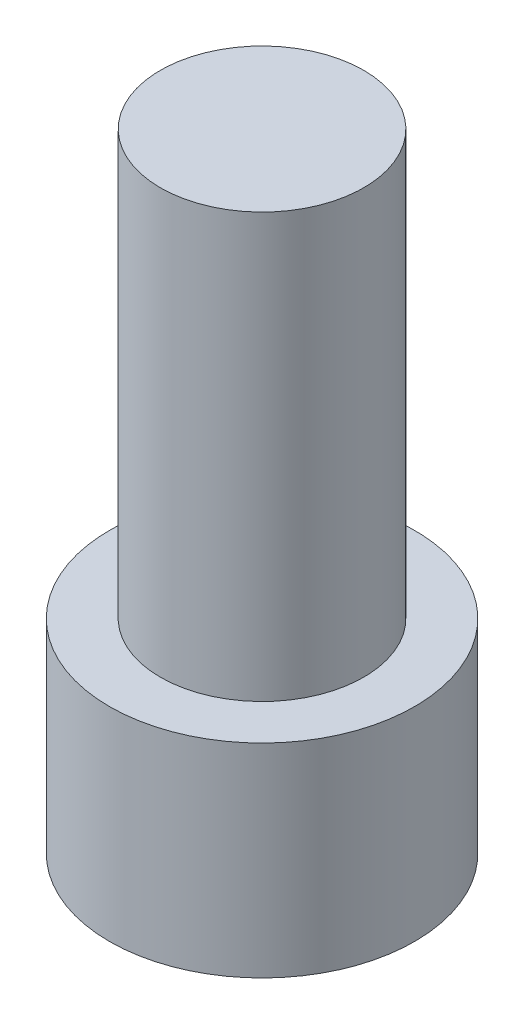
ISO-10303-21;
HEADER;
FILE_DESCRIPTION(('STEP AP214'),'2;1');
FILE_NAME('part.step','',(''),(''),'','','');
FILE_SCHEMA(('AUTOMOTIVE_DESIGN { 1 0 10303 214 1 1 1 1 }'));
ENDSEC;
DATA;
#1=APPLICATION_CONTEXT('core data for automotive mechanical design processes');
#2=APPLICATION_PROTOCOL_DEFINITION('international standard','automotive_design',2000,#1);
#3=PRODUCT_CONTEXT('',#1,'mechanical');
#4=PRODUCT('Part','Part','',(#3));
#5=PRODUCT_RELATED_PRODUCT_CATEGORY('part','',(#4));
#6=PRODUCT_DEFINITION_FORMATION('','',#4);
#7=PRODUCT_DEFINITION_CONTEXT('part definition',#1,'design');
#8=PRODUCT_DEFINITION('design','',#6,#7);
#9=PRODUCT_DEFINITION_SHAPE('','',#8);
#10=(LENGTH_UNIT() NAMED_UNIT(*) SI_UNIT(.MILLI.,.METRE.));
#11=(NAMED_UNIT(*) PLANE_ANGLE_UNIT() SI_UNIT($,.RADIAN.));
#12=(NAMED_UNIT(*) SI_UNIT($,.STERADIAN.) SOLID_ANGLE_UNIT());
#13=UNCERTAINTY_MEASURE_WITH_UNIT(LENGTH_MEASURE(1.E-05),#10,'distance_accuracy_value','');
#14=(GEOMETRIC_REPRESENTATION_CONTEXT(3) GLOBAL_UNCERTAINTY_ASSIGNED_CONTEXT((#13)) GLOBAL_UNIT_ASSIGNED_CONTEXT((#10,
#11,#12)) REPRESENTATION_CONTEXT('',''));
#15=CARTESIAN_POINT('',(0.,0.,0.));
#16=DIRECTION('',(0.,0.,1.));
#17=DIRECTION('',(1.,0.,0.));
#18=AXIS2_PLACEMENT_3D('',#15,#16,#17);
#19=CARTESIAN_POINT('',(0.,12.,0.));
#20=DIRECTION('',(0.,1.,0.));
#21=DIRECTION('',(0.,0.,1.));
#22=AXIS2_PLACEMENT_3D('',#19,#20,#21);
#23=PLANE('',#22);
#24=CARTESIAN_POINT('',(0.,12.,0.));
#25=DIRECTION('',(0.,1.,0.));
#26=DIRECTION('',(0.,0.,1.));
#27=AXIS2_PLACEMENT_3D('',#24,#25,#26);
#28=CIRCLE('',#27,9.);
#29=CARTESIAN_POINT('',(0.,12.,9.));
#30=VERTEX_POINT('',#29);
#31=EDGE_CURVE('E10',#30,#30,#28,.T.);
#32=ORIENTED_EDGE('',*,*,#31,.T.);
#33=EDGE_LOOP('',(#32));
#34=FACE_BOUND('',#33,.T.);
#35=CARTESIAN_POINT('',(0.,12.,0.));
#36=DIRECTION('',(0.,1.,0.));
#37=DIRECTION('',(0.,0.,1.));
#38=AXIS2_PLACEMENT_3D('',#35,#36,#37);
#39=CIRCLE('',#38,6.);
#40=CARTESIAN_POINT('',(0.,12.,6.));
#41=VERTEX_POINT('',#40);
#42=EDGE_CURVE('E46',#41,#41,#39,.T.);
#43=ORIENTED_EDGE('',*,*,#42,.F.);
#44=EDGE_LOOP('',(#43));
#45=FACE_BOUND('',#44,.T.);
#46=ADVANCED_FACE('F33',(#34,#45),#23,.T.);
#47=CARTESIAN_POINT('',(0.,12.,0.));
#48=DIRECTION('',(0.,-1.,0.));
#49=DIRECTION('',(0.,0.,-1.));
#50=AXIS2_PLACEMENT_3D('',#47,#48,#49);
#51=CYLINDRICAL_SURFACE('',#50,9.);
#52=ORIENTED_EDGE('',*,*,#31,.F.);
#53=EDGE_LOOP('',(#52));
#54=FACE_BOUND('',#53,.T.);
#55=CARTESIAN_POINT('',(0.,0.,0.));
#56=DIRECTION('',(0.,1.,0.));
#57=DIRECTION('',(0.,0.,1.));
#58=AXIS2_PLACEMENT_3D('',#55,#56,#57);
#59=CIRCLE('',#58,9.);
#60=CARTESIAN_POINT('',(0.,0.,9.));
#61=VERTEX_POINT('',#60);
#62=EDGE_CURVE('E37',#61,#61,#59,.T.);
#63=ORIENTED_EDGE('',*,*,#62,.T.);
#64=EDGE_LOOP('',(#63));
#65=FACE_BOUND('',#64,.T.);
#66=ADVANCED_FACE('F35',(#54,#65),#51,.T.);
#67=CARTESIAN_POINT('',(0.,0.,0.));
#68=DIRECTION('',(0.,1.,0.));
#69=DIRECTION('',(0.,0.,1.));
#70=AXIS2_PLACEMENT_3D('',#67,#68,#69);
#71=PLANE('',#70);
#72=ORIENTED_EDGE('',*,*,#62,.F.);
#73=EDGE_LOOP('',(#72));
#74=FACE_BOUND('',#73,.T.);
#75=ADVANCED_FACE('F57',(#74),#71,.F.);
#76=CARTESIAN_POINT('',(0.,37.,0.));
#77=DIRECTION('',(0.,-1.,0.));
#78=DIRECTION('',(0.,0.,-1.));
#79=AXIS2_PLACEMENT_3D('',#76,#77,#78);
#80=CYLINDRICAL_SURFACE('',#79,6.);
#81=CARTESIAN_POINT('',(0.,37.,0.));
#82=DIRECTION('',(0.,1.,0.));
#83=DIRECTION('',(0.,0.,1.));
#84=AXIS2_PLACEMENT_3D('',#81,#82,#83);
#85=CIRCLE('',#84,6.);
#86=CARTESIAN_POINT('',(0.,37.,6.));
#87=VERTEX_POINT('',#86);
#88=EDGE_CURVE('E44',#87,#87,#85,.T.);
#89=ORIENTED_EDGE('',*,*,#88,.F.);
#90=EDGE_LOOP('',(#89));
#91=FACE_BOUND('',#90,.T.);
#92=ORIENTED_EDGE('',*,*,#42,.T.);
#93=EDGE_LOOP('',(#92));
#94=FACE_BOUND('',#93,.T.);
#95=ADVANCED_FACE('F54',(#91,#94),#80,.T.);
#96=CARTESIAN_POINT('',(0.,37.,0.));
#97=DIRECTION('',(0.,1.,0.));
#98=DIRECTION('',(0.,0.,1.));
#99=AXIS2_PLACEMENT_3D('',#96,#97,#98);
#100=PLANE('',#99);
#101=ORIENTED_EDGE('',*,*,#88,.T.);
#102=EDGE_LOOP('',(#101));
#103=FACE_BOUND('',#102,.T.);
#104=ADVANCED_FACE('F52',(#103),#100,.T.);
#105=CLOSED_SHELL('',(#46,#66,#75,#95,#104));
#106=MANIFOLD_SOLID_BREP('B2',#105);
#107=ADVANCED_BREP_SHAPE_REPRESENTATION('',(#18,#106),#14);
#108=SHAPE_DEFINITION_REPRESENTATION(#9,#107);
ENDSEC;
END-ISO-10303-21;
